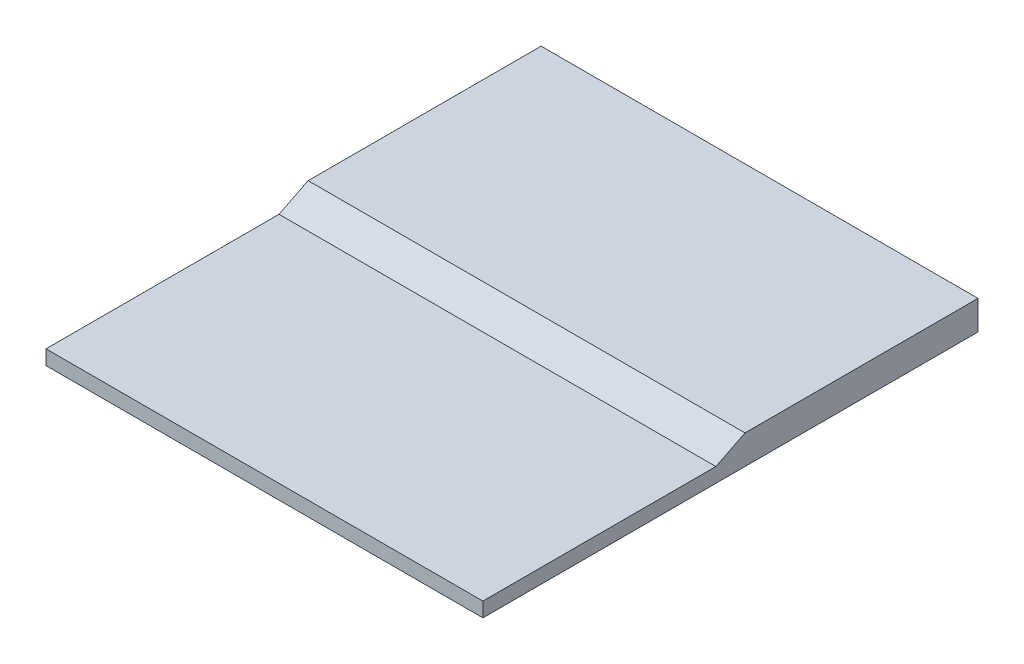
ISO-10303-21;
HEADER;
FILE_DESCRIPTION(('STEP AP214'),'2;1');
FILE_NAME('part.step','',(''),(''),'','','');
FILE_SCHEMA(('AUTOMOTIVE_DESIGN { 1 0 10303 214 1 1 1 1 }'));
ENDSEC;
DATA;
#1=APPLICATION_CONTEXT('core data for automotive mechanical design processes');
#2=APPLICATION_PROTOCOL_DEFINITION('international standard','automotive_design',2000,#1);
#3=PRODUCT_CONTEXT('',#1,'mechanical');
#4=PRODUCT('Part','Part','',(#3));
#5=PRODUCT_RELATED_PRODUCT_CATEGORY('part','',(#4));
#6=PRODUCT_DEFINITION_FORMATION('','',#4);
#7=PRODUCT_DEFINITION_CONTEXT('part definition',#1,'design');
#8=PRODUCT_DEFINITION('design','',#6,#7);
#9=PRODUCT_DEFINITION_SHAPE('','',#8);
#10=(LENGTH_UNIT() NAMED_UNIT(*) SI_UNIT(.MILLI.,.METRE.));
#11=(NAMED_UNIT(*) PLANE_ANGLE_UNIT() SI_UNIT($,.RADIAN.));
#12=(NAMED_UNIT(*) SI_UNIT($,.STERADIAN.) SOLID_ANGLE_UNIT());
#13=UNCERTAINTY_MEASURE_WITH_UNIT(LENGTH_MEASURE(1.E-05),#10,'distance_accuracy_value','');
#14=(GEOMETRIC_REPRESENTATION_CONTEXT(3) GLOBAL_UNCERTAINTY_ASSIGNED_CONTEXT((#13)) GLOBAL_UNIT_ASSIGNED_CONTEXT((#10,
#11,#12)) REPRESENTATION_CONTEXT('',''));
#15=CARTESIAN_POINT('',(0.,0.,0.));
#16=DIRECTION('',(0.,0.,1.));
#17=DIRECTION('',(1.,0.,0.));
#18=AXIS2_PLACEMENT_3D('',#15,#16,#17);
#19=CARTESIAN_POINT('',(762.,-25.4,406.4));
#20=DIRECTION('',(0.,0.,-1.));
#21=DIRECTION('',(-1.,0.,0.));
#22=AXIS2_PLACEMENT_3D('',#19,#20,#21);
#23=PLANE('',#22);
#24=DIRECTION('',(0.,-1.,0.));
#25=VECTOR('',#24,1.);
#26=CARTESIAN_POINT('',(0.,-25.4,406.4));
#27=LINE('',#26,#25);
#28=CARTESIAN_POINT('',(0.,0.,406.4));
#29=VERTEX_POINT('',#28);
#30=CARTESIAN_POINT('',(0.,-25.4,406.4));
#31=VERTEX_POINT('',#30);
#32=EDGE_CURVE('E117',#29,#31,#27,.T.);
#33=ORIENTED_EDGE('',*,*,#32,.T.);
#34=DIRECTION('',(-1.,0.,0.));
#35=VECTOR('',#34,1.);
#36=CARTESIAN_POINT('',(762.,-25.4,406.4));
#37=LINE('',#36,#35);
#38=CARTESIAN_POINT('',(762.,-25.4,406.4));
#39=VERTEX_POINT('',#38);
#40=EDGE_CURVE('E11',#39,#31,#37,.T.);
#41=ORIENTED_EDGE('',*,*,#40,.F.);
#42=DIRECTION('',(0.,-1.,0.));
#43=VECTOR('',#42,1.);
#44=CARTESIAN_POINT('',(762.,-25.4,406.4));
#45=LINE('',#44,#43);
#46=CARTESIAN_POINT('',(762.,0.,406.4));
#47=VERTEX_POINT('',#46);
#48=EDGE_CURVE('E127',#47,#39,#45,.T.);
#49=ORIENTED_EDGE('',*,*,#48,.F.);
#50=DIRECTION('',(-1.,0.,0.));
#51=VECTOR('',#50,1.);
#52=CARTESIAN_POINT('',(762.,0.,406.4));
#53=LINE('',#52,#51);
#54=EDGE_CURVE('E113',#47,#29,#53,.T.);
#55=ORIENTED_EDGE('',*,*,#54,.T.);
#56=EDGE_LOOP('',(#33,#41,#49,#55));
#57=FACE_BOUND('',#56,.T.);
#58=ADVANCED_FACE('F33',(#57),#23,.F.);
#59=CARTESIAN_POINT('',(762.,-25.3999999999999,-457.2));
#60=DIRECTION('',(0.,1.,0.));
#61=DIRECTION('',(0.,0.,1.));
#62=AXIS2_PLACEMENT_3D('',#59,#60,#61);
#63=PLANE('',#62);
#64=DIRECTION('',(0.,0.,-1.));
#65=VECTOR('',#64,1.);
#66=CARTESIAN_POINT('',(0.,-25.3999999999999,-457.2));
#67=LINE('',#66,#65);
#68=CARTESIAN_POINT('',(0.,-25.3999999999999,-457.2));
#69=VERTEX_POINT('',#68);
#70=EDGE_CURVE('E120',#31,#69,#67,.T.);
#71=ORIENTED_EDGE('',*,*,#70,.T.);
#72=DIRECTION('',(-1.,0.,0.));
#73=VECTOR('',#72,1.);
#74=CARTESIAN_POINT('',(762.,-25.3999999999999,-457.2));
#75=LINE('',#74,#73);
#76=CARTESIAN_POINT('',(762.,-25.3999999999999,-457.2));
#77=VERTEX_POINT('',#76);
#78=EDGE_CURVE('E41',#77,#69,#75,.T.);
#79=ORIENTED_EDGE('',*,*,#78,.F.);
#80=DIRECTION('',(0.,0.,-1.));
#81=VECTOR('',#80,1.);
#82=CARTESIAN_POINT('',(762.,-25.3999999999999,-457.2));
#83=LINE('',#82,#81);
#84=EDGE_CURVE('E86',#39,#77,#83,.T.);
#85=ORIENTED_EDGE('',*,*,#84,.F.);
#86=ORIENTED_EDGE('',*,*,#40,.T.);
#87=EDGE_LOOP('',(#71,#79,#85,#86));
#88=FACE_BOUND('',#87,.T.);
#89=ADVANCED_FACE('F151',(#88),#63,.F.);
#90=CARTESIAN_POINT('',(762.,25.4,-457.2));
#91=DIRECTION('',(0.,0.,1.));
#92=DIRECTION('',(1.,0.,0.));
#93=AXIS2_PLACEMENT_3D('',#90,#91,#92);
#94=PLANE('',#93);
#95=DIRECTION('',(0.,1.,0.));
#96=VECTOR('',#95,1.);
#97=CARTESIAN_POINT('',(0.,25.4,-457.2));
#98=LINE('',#97,#96);
#99=CARTESIAN_POINT('',(0.,25.4,-457.2));
#100=VERTEX_POINT('',#99);
#101=EDGE_CURVE('E122',#69,#100,#98,.T.);
#102=ORIENTED_EDGE('',*,*,#101,.T.);
#103=DIRECTION('',(-1.,0.,0.));
#104=VECTOR('',#103,1.);
#105=CARTESIAN_POINT('',(762.,25.4,-457.2));
#106=LINE('',#105,#104);
#107=CARTESIAN_POINT('',(762.,25.4,-457.2));
#108=VERTEX_POINT('',#107);
#109=EDGE_CURVE('E108',#108,#100,#106,.T.);
#110=ORIENTED_EDGE('',*,*,#109,.F.);
#111=DIRECTION('',(0.,1.,0.));
#112=VECTOR('',#111,1.);
#113=CARTESIAN_POINT('',(762.,25.4,-457.2));
#114=LINE('',#113,#112);
#115=EDGE_CURVE('E99',#77,#108,#114,.T.);
#116=ORIENTED_EDGE('',*,*,#115,.F.);
#117=ORIENTED_EDGE('',*,*,#78,.T.);
#118=EDGE_LOOP('',(#102,#110,#116,#117));
#119=FACE_BOUND('',#118,.T.);
#120=ADVANCED_FACE('F133',(#119),#94,.F.);
#121=CARTESIAN_POINT('',(762.,25.4,-50.8));
#122=DIRECTION('',(0.,-1.,0.));
#123=DIRECTION('',(0.,0.,-1.));
#124=AXIS2_PLACEMENT_3D('',#121,#122,#123);
#125=PLANE('',#124);
#126=DIRECTION('',(0.,0.,1.));
#127=VECTOR('',#126,1.);
#128=CARTESIAN_POINT('',(0.,25.4,-50.8));
#129=LINE('',#128,#127);
#130=CARTESIAN_POINT('',(0.,25.4,-50.8));
#131=VERTEX_POINT('',#130);
#132=EDGE_CURVE('E107',#100,#131,#129,.T.);
#133=ORIENTED_EDGE('',*,*,#132,.T.);
#134=DIRECTION('',(-1.,0.,0.));
#135=VECTOR('',#134,1.);
#136=CARTESIAN_POINT('',(762.,25.4,-50.8));
#137=LINE('',#136,#135);
#138=CARTESIAN_POINT('',(762.,25.4,-50.8));
#139=VERTEX_POINT('',#138);
#140=EDGE_CURVE('E104',#139,#131,#137,.T.);
#141=ORIENTED_EDGE('',*,*,#140,.F.);
#142=DIRECTION('',(0.,0.,1.));
#143=VECTOR('',#142,1.);
#144=CARTESIAN_POINT('',(762.,25.4,-50.8));
#145=LINE('',#144,#143);
#146=EDGE_CURVE('E93',#108,#139,#145,.T.);
#147=ORIENTED_EDGE('',*,*,#146,.F.);
#148=ORIENTED_EDGE('',*,*,#109,.T.);
#149=EDGE_LOOP('',(#133,#141,#147,#148));
#150=FACE_BOUND('',#149,.T.);
#151=ADVANCED_FACE('F105',(#150),#125,.F.);
#152=CARTESIAN_POINT('',(762.,0.,0.));
#153=DIRECTION('',(0.,-0.894427190999916,-0.447213595499958));
#154=DIRECTION('',(0.,0.447213595499958,-0.894427190999916));
#155=AXIS2_PLACEMENT_3D('',#152,#153,#154);
#156=PLANE('',#155);
#157=DIRECTION('',(0.,-0.447213595499958,0.894427190999916));
#158=VECTOR('',#157,1.);
#159=CARTESIAN_POINT('',(0.,0.,0.));
#160=LINE('',#159,#158);
#161=CARTESIAN_POINT('',(0.,0.,0.));
#162=VERTEX_POINT('',#161);
#163=EDGE_CURVE('E72',#131,#162,#160,.T.);
#164=ORIENTED_EDGE('',*,*,#163,.T.);
#165=DIRECTION('',(-1.,0.,0.));
#166=VECTOR('',#165,1.);
#167=CARTESIAN_POINT('',(762.,0.,0.));
#168=LINE('',#167,#166);
#169=CARTESIAN_POINT('',(762.,0.,0.));
#170=VERTEX_POINT('',#169);
#171=EDGE_CURVE('E109',#170,#162,#168,.T.);
#172=ORIENTED_EDGE('',*,*,#171,.F.);
#173=DIRECTION('',(0.,-0.447213595499958,0.894427190999916));
#174=VECTOR('',#173,1.);
#175=CARTESIAN_POINT('',(762.,0.,0.));
#176=LINE('',#175,#174);
#177=EDGE_CURVE('E97',#139,#170,#176,.T.);
#178=ORIENTED_EDGE('',*,*,#177,.F.);
#179=ORIENTED_EDGE('',*,*,#140,.T.);
#180=EDGE_LOOP('',(#164,#172,#178,#179));
#181=FACE_BOUND('',#180,.T.);
#182=ADVANCED_FACE('F111',(#181),#156,.F.);
#183=CARTESIAN_POINT('',(762.,0.,406.4));
#184=DIRECTION('',(0.,-1.,0.));
#185=DIRECTION('',(0.,0.,-1.));
#186=AXIS2_PLACEMENT_3D('',#183,#184,#185);
#187=PLANE('',#186);
#188=DIRECTION('',(0.,0.,1.));
#189=VECTOR('',#188,1.);
#190=CARTESIAN_POINT('',(0.,0.,406.4));
#191=LINE('',#190,#189);
#192=EDGE_CURVE('E78',#162,#29,#191,.T.);
#193=ORIENTED_EDGE('',*,*,#192,.T.);
#194=ORIENTED_EDGE('',*,*,#54,.F.);
#195=DIRECTION('',(0.,0.,1.));
#196=VECTOR('',#195,1.);
#197=CARTESIAN_POINT('',(762.,0.,406.4));
#198=LINE('',#197,#196);
#199=EDGE_CURVE('E49',#170,#47,#198,.T.);
#200=ORIENTED_EDGE('',*,*,#199,.F.);
#201=ORIENTED_EDGE('',*,*,#171,.T.);
#202=EDGE_LOOP('',(#193,#194,#200,#201));
#203=FACE_BOUND('',#202,.T.);
#204=ADVANCED_FACE('F140',(#203),#187,.F.);
#205=CARTESIAN_POINT('',(762.,0.,0.));
#206=DIRECTION('',(-1.,0.,0.));
#207=DIRECTION('',(0.,0.,1.));
#208=AXIS2_PLACEMENT_3D('',#205,#206,#207);
#209=PLANE('',#208);
#210=ORIENTED_EDGE('',*,*,#48,.T.);
#211=ORIENTED_EDGE('',*,*,#84,.T.);
#212=ORIENTED_EDGE('',*,*,#115,.T.);
#213=ORIENTED_EDGE('',*,*,#146,.T.);
#214=ORIENTED_EDGE('',*,*,#177,.T.);
#215=ORIENTED_EDGE('',*,*,#199,.T.);
#216=EDGE_LOOP('',(#210,#211,#212,#213,#214,#215));
#217=FACE_BOUND('',#216,.T.);
#218=ADVANCED_FACE('F95',(#217),#209,.F.);
#219=CARTESIAN_POINT('',(0.,0.,0.));
#220=DIRECTION('',(-1.,0.,0.));
#221=DIRECTION('',(0.,0.,1.));
#222=AXIS2_PLACEMENT_3D('',#219,#220,#221);
#223=PLANE('',#222);
#224=ORIENTED_EDGE('',*,*,#32,.F.);
#225=ORIENTED_EDGE('',*,*,#192,.F.);
#226=ORIENTED_EDGE('',*,*,#163,.F.);
#227=ORIENTED_EDGE('',*,*,#132,.F.);
#228=ORIENTED_EDGE('',*,*,#101,.F.);
#229=ORIENTED_EDGE('',*,*,#70,.F.);
#230=EDGE_LOOP('',(#224,#225,#226,#227,#228,#229));
#231=FACE_BOUND('',#230,.T.);
#232=ADVANCED_FACE('F136',(#231),#223,.T.);
#233=CLOSED_SHELL('',(#58,#89,#120,#151,#182,#204,#218,#232));
#234=MANIFOLD_SOLID_BREP('B2',#233);
#235=ADVANCED_BREP_SHAPE_REPRESENTATION('',(#18,#234),#14);
#236=SHAPE_DEFINITION_REPRESENTATION(#9,#235);
ENDSEC;
END-ISO-10303-21;
